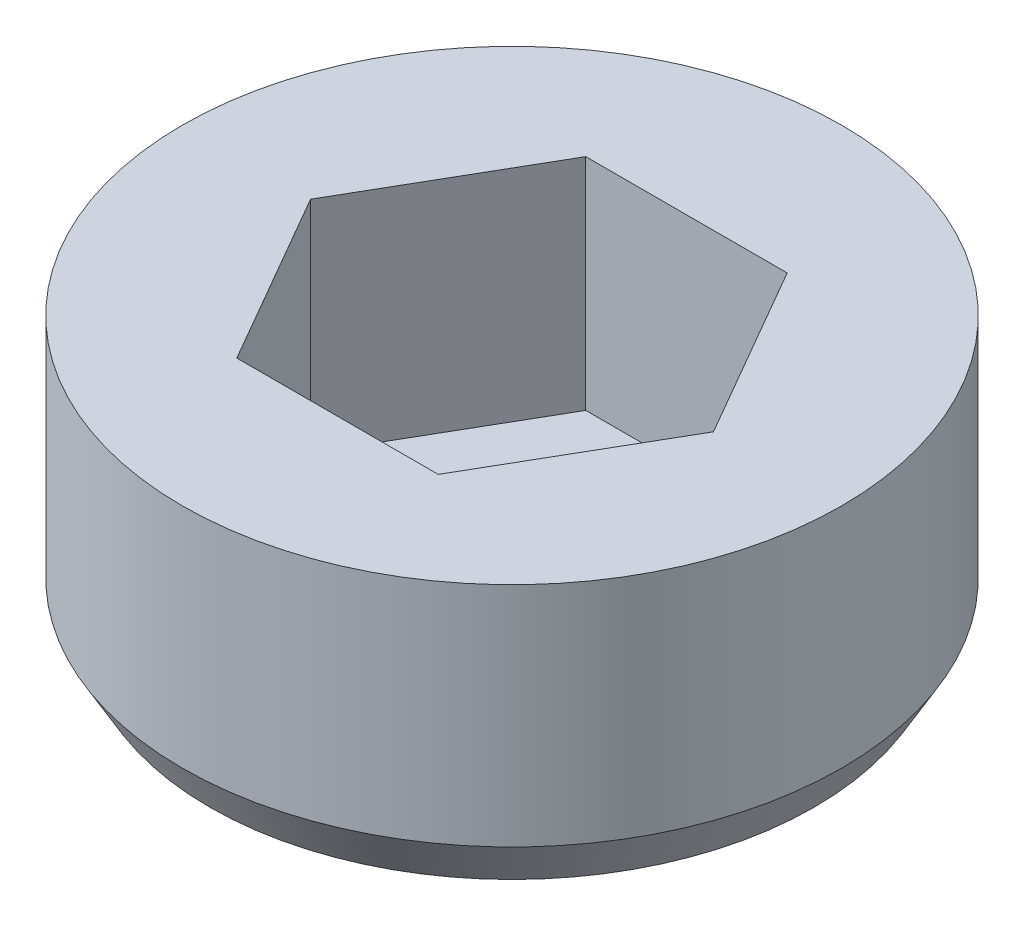
ISO-10303-21;
HEADER;
FILE_DESCRIPTION(('STEP AP214'),'2;1');
FILE_NAME('part.step','',(''),(''),'','','');
FILE_SCHEMA(('AUTOMOTIVE_DESIGN { 1 0 10303 214 1 1 1 1 }'));
ENDSEC;
DATA;
#1=APPLICATION_CONTEXT('core data for automotive mechanical design processes');
#2=APPLICATION_PROTOCOL_DEFINITION('international standard','automotive_design',2000,#1);
#3=PRODUCT_CONTEXT('',#1,'mechanical');
#4=PRODUCT('Part','Part','',(#3));
#5=PRODUCT_RELATED_PRODUCT_CATEGORY('part','',(#4));
#6=PRODUCT_DEFINITION_FORMATION('','',#4);
#7=PRODUCT_DEFINITION_CONTEXT('part definition',#1,'design');
#8=PRODUCT_DEFINITION('design','',#6,#7);
#9=PRODUCT_DEFINITION_SHAPE('','',#8);
#10=(LENGTH_UNIT() NAMED_UNIT(*) SI_UNIT(.MILLI.,.METRE.));
#11=(NAMED_UNIT(*) PLANE_ANGLE_UNIT() SI_UNIT($,.RADIAN.));
#12=(NAMED_UNIT(*) SI_UNIT($,.STERADIAN.) SOLID_ANGLE_UNIT());
#13=UNCERTAINTY_MEASURE_WITH_UNIT(LENGTH_MEASURE(1.E-05),#10,'distance_accuracy_value','');
#14=(GEOMETRIC_REPRESENTATION_CONTEXT(3) GLOBAL_UNCERTAINTY_ASSIGNED_CONTEXT((#13)) GLOBAL_UNIT_ASSIGNED_CONTEXT((#10,
#11,#12)) REPRESENTATION_CONTEXT('',''));
#15=CARTESIAN_POINT('',(0.,0.,0.));
#16=DIRECTION('',(0.,0.,1.));
#17=DIRECTION('',(1.,0.,0.));
#18=AXIS2_PLACEMENT_3D('',#15,#16,#17);
#19=CARTESIAN_POINT('',(0.,10.,0.));
#20=DIRECTION('',(0.,-1.,0.));
#21=DIRECTION('',(0.,0.,-1.));
#22=AXIS2_PLACEMENT_3D('',#19,#20,#21);
#23=CYLINDRICAL_SURFACE('',#22,3.1);
#24=CARTESIAN_POINT('',(0.,0.,0.));
#25=DIRECTION('',(0.,1.,0.));
#26=DIRECTION('',(0.,0.,1.));
#27=AXIS2_PLACEMENT_3D('',#24,#25,#26);
#28=CIRCLE('',#27,3.1);
#29=CARTESIAN_POINT('',(0.,0.,3.1));
#30=VERTEX_POINT('',#29);
#31=EDGE_CURVE('E150',#30,#30,#28,.T.);
#32=ORIENTED_EDGE('',*,*,#31,.F.);
#33=EDGE_LOOP('',(#32));
#34=FACE_BOUND('',#33,.T.);
#35=CARTESIAN_POINT('',(0.,2.,0.));
#36=DIRECTION('',(0.,1.,0.));
#37=DIRECTION('',(0.,0.,1.));
#38=AXIS2_PLACEMENT_3D('',#35,#36,#37);
#39=CIRCLE('',#38,3.1);
#40=CARTESIAN_POINT('',(0.,2.,3.1));
#41=VERTEX_POINT('',#40);
#42=EDGE_CURVE('E144',#41,#41,#39,.T.);
#43=ORIENTED_EDGE('',*,*,#42,.T.);
#44=EDGE_LOOP('',(#43));
#45=FACE_BOUND('',#44,.T.);
#46=ADVANCED_FACE('F41',(#34,#45),#23,.F.);
#47=CARTESIAN_POINT('',(0.,10.,0.));
#48=DIRECTION('',(0.,1.,0.));
#49=DIRECTION('',(0.,0.,1.));
#50=AXIS2_PLACEMENT_3D('',#47,#48,#49);
#51=PLANE('',#50);
#52=DIRECTION('',(0.5,0.,-0.866025403784439));
#53=VECTOR('',#52,1.);
#54=CARTESIAN_POINT('',(3.66617420935412,10.,6.35));
#55=LINE('',#54,#53);
#56=CARTESIAN_POINT('',(3.66617420935412,10.,6.35));
#57=VERTEX_POINT('',#56);
#58=CARTESIAN_POINT('',(7.33234841870825,10.,0.));
#59=VERTEX_POINT('',#58);
#60=EDGE_CURVE('E57',#57,#59,#55,.T.);
#61=ORIENTED_EDGE('',*,*,#60,.F.);
#62=DIRECTION('',(1.,0.,0.));
#63=VECTOR('',#62,1.);
#64=CARTESIAN_POINT('',(-3.66617420935412,10.,6.35));
#65=LINE('',#64,#63);
#66=CARTESIAN_POINT('',(-3.66617420935412,10.,6.35));
#67=VERTEX_POINT('',#66);
#68=EDGE_CURVE('E140',#67,#57,#65,.T.);
#69=ORIENTED_EDGE('',*,*,#68,.F.);
#70=DIRECTION('',(0.5,0.,0.866025403784439));
#71=VECTOR('',#70,1.);
#72=CARTESIAN_POINT('',(-7.33234841870825,10.,0.));
#73=LINE('',#72,#71);
#74=CARTESIAN_POINT('',(-7.33234841870825,10.,0.));
#75=VERTEX_POINT('',#74);
#76=EDGE_CURVE('E138',#75,#67,#73,.T.);
#77=ORIENTED_EDGE('',*,*,#76,.F.);
#78=DIRECTION('',(-0.5,0.,0.866025403784439));
#79=VECTOR('',#78,1.);
#80=CARTESIAN_POINT('',(-3.66617420935412,10.,-6.35));
#81=LINE('',#80,#79);
#82=CARTESIAN_POINT('',(-3.66617420935412,10.,-6.35));
#83=VERTEX_POINT('',#82);
#84=EDGE_CURVE('E105',#83,#75,#81,.T.);
#85=ORIENTED_EDGE('',*,*,#84,.F.);
#86=DIRECTION('',(-1.,0.,0.));
#87=VECTOR('',#86,1.);
#88=CARTESIAN_POINT('',(3.66617420935412,10.,-6.35));
#89=LINE('',#88,#87);
#90=CARTESIAN_POINT('',(3.66617420935412,10.,-6.35));
#91=VERTEX_POINT('',#90);
#92=EDGE_CURVE('E134',#91,#83,#89,.T.);
#93=ORIENTED_EDGE('',*,*,#92,.F.);
#94=DIRECTION('',(-0.5,0.,-0.866025403784438));
#95=VECTOR('',#94,1.);
#96=CARTESIAN_POINT('',(7.33234841870825,10.,0.));
#97=LINE('',#96,#95);
#98=EDGE_CURVE('E131',#59,#91,#97,.T.);
#99=ORIENTED_EDGE('',*,*,#98,.F.);
#100=EDGE_LOOP('',(#61,#69,#77,#85,#93,#99));
#101=FACE_BOUND('',#100,.T.);
#102=CARTESIAN_POINT('',(0.,10.,0.));
#103=DIRECTION('',(0.,1.,0.));
#104=DIRECTION('',(0.,0.,1.));
#105=AXIS2_PLACEMENT_3D('',#102,#103,#104);
#106=CIRCLE('',#105,12.);
#107=CARTESIAN_POINT('',(0.,10.,12.));
#108=VERTEX_POINT('',#107);
#109=EDGE_CURVE('E153',#108,#108,#106,.T.);
#110=ORIENTED_EDGE('',*,*,#109,.T.);
#111=EDGE_LOOP('',(#110));
#112=FACE_BOUND('',#111,.T.);
#113=ADVANCED_FACE('F174',(#101,#112),#51,.T.);
#114=CARTESIAN_POINT('',(0.,0.,0.));
#115=DIRECTION('',(0.,1.,0.));
#116=DIRECTION('',(0.,0.,1.));
#117=AXIS2_PLACEMENT_3D('',#114,#115,#116);
#118=PLANE('',#117);
#119=CARTESIAN_POINT('',(0.,0.,0.));
#120=DIRECTION('',(0.,1.,0.));
#121=DIRECTION('',(0.,0.,1.));
#122=AXIS2_PLACEMENT_3D('',#119,#120,#121);
#123=CIRCLE('',#122,11.);
#124=CARTESIAN_POINT('',(0.,0.,11.));
#125=VERTEX_POINT('',#124);
#126=EDGE_CURVE('E11',#125,#125,#123,.F.);
#127=ORIENTED_EDGE('',*,*,#126,.T.);
#128=EDGE_LOOP('',(#127));
#129=FACE_BOUND('',#128,.T.);
#130=ORIENTED_EDGE('',*,*,#31,.T.);
#131=EDGE_LOOP('',(#130));
#132=FACE_BOUND('',#131,.T.);
#133=ADVANCED_FACE('F180',(#129,#132),#118,.F.);
#134=CARTESIAN_POINT('',(0.,10.,0.));
#135=DIRECTION('',(0.,-1.,0.));
#136=DIRECTION('',(0.,0.,-1.));
#137=AXIS2_PLACEMENT_3D('',#134,#135,#136);
#138=CYLINDRICAL_SURFACE('',#137,12.);
#139=CARTESIAN_POINT('',(0.,1.73205080756888,0.));
#140=DIRECTION('',(0.,1.,0.));
#141=DIRECTION('',(0.,0.,1.));
#142=AXIS2_PLACEMENT_3D('',#139,#140,#141);
#143=CIRCLE('',#142,12.);
#144=CARTESIAN_POINT('',(0.,1.73205080756888,12.));
#145=VERTEX_POINT('',#144);
#146=EDGE_CURVE('E50',#145,#145,#143,.T.);
#147=ORIENTED_EDGE('',*,*,#146,.T.);
#148=EDGE_LOOP('',(#147));
#149=FACE_BOUND('',#148,.T.);
#150=ORIENTED_EDGE('',*,*,#109,.F.);
#151=EDGE_LOOP('',(#150));
#152=FACE_BOUND('',#151,.T.);
#153=ADVANCED_FACE('F160',(#149,#152),#138,.T.);
#154=CARTESIAN_POINT('',(3.66617420935412,2.,6.35));
#155=DIRECTION('',(0.866025403784439,0.,0.5));
#156=DIRECTION('',(0.5,0.,-0.866025403784439));
#157=AXIS2_PLACEMENT_3D('',#154,#155,#156);
#158=PLANE('',#157);
#159=ORIENTED_EDGE('',*,*,#60,.T.);
#160=DIRECTION('',(0.,1.,0.));
#161=VECTOR('',#160,1.);
#162=CARTESIAN_POINT('',(7.33234841870825,2.,0.));
#163=LINE('',#162,#161);
#164=CARTESIAN_POINT('',(7.33234841870825,2.,0.));
#165=VERTEX_POINT('',#164);
#166=EDGE_CURVE('E87',#165,#59,#163,.T.);
#167=ORIENTED_EDGE('',*,*,#166,.F.);
#168=DIRECTION('',(0.5,0.,-0.866025403784439));
#169=VECTOR('',#168,1.);
#170=CARTESIAN_POINT('',(3.66617420935412,2.,6.35));
#171=LINE('',#170,#169);
#172=CARTESIAN_POINT('',(3.66617420935412,2.,6.35));
#173=VERTEX_POINT('',#172);
#174=EDGE_CURVE('E142',#173,#165,#171,.T.);
#175=ORIENTED_EDGE('',*,*,#174,.F.);
#176=DIRECTION('',(0.,1.,0.));
#177=VECTOR('',#176,1.);
#178=CARTESIAN_POINT('',(3.66617420935412,2.,6.35));
#179=LINE('',#178,#177);
#180=EDGE_CURVE('E65',#173,#57,#179,.T.);
#181=ORIENTED_EDGE('',*,*,#180,.T.);
#182=EDGE_LOOP('',(#159,#167,#175,#181));
#183=FACE_BOUND('',#182,.T.);
#184=ADVANCED_FACE('F186',(#183),#158,.F.);
#185=CARTESIAN_POINT('',(-3.66617420935412,2.,6.35));
#186=DIRECTION('',(0.,0.,1.));
#187=DIRECTION('',(1.,0.,0.));
#188=AXIS2_PLACEMENT_3D('',#185,#186,#187);
#189=PLANE('',#188);
#190=ORIENTED_EDGE('',*,*,#68,.T.);
#191=ORIENTED_EDGE('',*,*,#180,.F.);
#192=DIRECTION('',(1.,0.,0.));
#193=VECTOR('',#192,1.);
#194=CARTESIAN_POINT('',(-3.66617420935412,2.,6.35));
#195=LINE('',#194,#193);
#196=CARTESIAN_POINT('',(-3.66617420935412,2.,6.35));
#197=VERTEX_POINT('',#196);
#198=EDGE_CURVE('E117',#197,#173,#195,.T.);
#199=ORIENTED_EDGE('',*,*,#198,.F.);
#200=DIRECTION('',(0.,1.,0.));
#201=VECTOR('',#200,1.);
#202=CARTESIAN_POINT('',(-3.66617420935412,2.,6.35));
#203=LINE('',#202,#201);
#204=EDGE_CURVE('E109',#197,#67,#203,.T.);
#205=ORIENTED_EDGE('',*,*,#204,.T.);
#206=EDGE_LOOP('',(#190,#191,#199,#205));
#207=FACE_BOUND('',#206,.T.);
#208=ADVANCED_FACE('F194',(#207),#189,.F.);
#209=CARTESIAN_POINT('',(-7.33234841870825,2.,0.));
#210=DIRECTION('',(-0.866025403784439,0.,0.5));
#211=DIRECTION('',(0.5,0.,0.866025403784439));
#212=AXIS2_PLACEMENT_3D('',#209,#210,#211);
#213=PLANE('',#212);
#214=ORIENTED_EDGE('',*,*,#76,.T.);
#215=ORIENTED_EDGE('',*,*,#204,.F.);
#216=DIRECTION('',(0.5,0.,0.866025403784439));
#217=VECTOR('',#216,1.);
#218=CARTESIAN_POINT('',(-7.33234841870825,2.,0.));
#219=LINE('',#218,#217);
#220=CARTESIAN_POINT('',(-7.33234841870825,2.,0.));
#221=VERTEX_POINT('',#220);
#222=EDGE_CURVE('E113',#221,#197,#219,.T.);
#223=ORIENTED_EDGE('',*,*,#222,.F.);
#224=DIRECTION('',(0.,1.,0.));
#225=VECTOR('',#224,1.);
#226=CARTESIAN_POINT('',(-7.33234841870825,2.,0.));
#227=LINE('',#226,#225);
#228=EDGE_CURVE('E98',#221,#75,#227,.T.);
#229=ORIENTED_EDGE('',*,*,#228,.T.);
#230=EDGE_LOOP('',(#214,#215,#223,#229));
#231=FACE_BOUND('',#230,.T.);
#232=ADVANCED_FACE('F114',(#231),#213,.F.);
#233=CARTESIAN_POINT('',(-3.66617420935412,2.,-6.35));
#234=DIRECTION('',(-0.866025403784439,0.,-0.5));
#235=DIRECTION('',(-0.5,0.,0.866025403784439));
#236=AXIS2_PLACEMENT_3D('',#233,#234,#235);
#237=PLANE('',#236);
#238=ORIENTED_EDGE('',*,*,#84,.T.);
#239=ORIENTED_EDGE('',*,*,#228,.F.);
#240=DIRECTION('',(-0.5,0.,0.866025403784439));
#241=VECTOR('',#240,1.);
#242=CARTESIAN_POINT('',(-3.66617420935412,2.,-6.35));
#243=LINE('',#242,#241);
#244=CARTESIAN_POINT('',(-3.66617420935412,2.,-6.35));
#245=VERTEX_POINT('',#244);
#246=EDGE_CURVE('E102',#245,#221,#243,.T.);
#247=ORIENTED_EDGE('',*,*,#246,.F.);
#248=DIRECTION('',(0.,1.,0.));
#249=VECTOR('',#248,1.);
#250=CARTESIAN_POINT('',(-3.66617420935412,2.,-6.35));
#251=LINE('',#250,#249);
#252=EDGE_CURVE('E110',#245,#83,#251,.T.);
#253=ORIENTED_EDGE('',*,*,#252,.T.);
#254=EDGE_LOOP('',(#238,#239,#247,#253));
#255=FACE_BOUND('',#254,.T.);
#256=ADVANCED_FACE('F100',(#255),#237,.F.);
#257=CARTESIAN_POINT('',(3.66617420935412,2.,-6.35));
#258=DIRECTION('',(0.,0.,-1.));
#259=DIRECTION('',(-1.,0.,0.));
#260=AXIS2_PLACEMENT_3D('',#257,#258,#259);
#261=PLANE('',#260);
#262=ORIENTED_EDGE('',*,*,#92,.T.);
#263=ORIENTED_EDGE('',*,*,#252,.F.);
#264=DIRECTION('',(-1.,0.,0.));
#265=VECTOR('',#264,1.);
#266=CARTESIAN_POINT('',(3.66617420935412,2.,-6.35));
#267=LINE('',#266,#265);
#268=CARTESIAN_POINT('',(3.66617420935412,2.,-6.35));
#269=VERTEX_POINT('',#268);
#270=EDGE_CURVE('E123',#269,#245,#267,.T.);
#271=ORIENTED_EDGE('',*,*,#270,.F.);
#272=DIRECTION('',(0.,1.,0.));
#273=VECTOR('',#272,1.);
#274=CARTESIAN_POINT('',(3.66617420935412,2.,-6.35));
#275=LINE('',#274,#273);
#276=EDGE_CURVE('E147',#269,#91,#275,.T.);
#277=ORIENTED_EDGE('',*,*,#276,.T.);
#278=EDGE_LOOP('',(#262,#263,#271,#277));
#279=FACE_BOUND('',#278,.T.);
#280=ADVANCED_FACE('F206',(#279),#261,.F.);
#281=CARTESIAN_POINT('',(7.33234841870825,2.,0.));
#282=DIRECTION('',(0.866025403784439,0.,-0.5));
#283=DIRECTION('',(-0.5,0.,-0.866025403784438));
#284=AXIS2_PLACEMENT_3D('',#281,#282,#283);
#285=PLANE('',#284);
#286=ORIENTED_EDGE('',*,*,#98,.T.);
#287=ORIENTED_EDGE('',*,*,#276,.F.);
#288=DIRECTION('',(-0.5,0.,-0.866025403784438));
#289=VECTOR('',#288,1.);
#290=CARTESIAN_POINT('',(7.33234841870825,2.,0.));
#291=LINE('',#290,#289);
#292=EDGE_CURVE('E125',#165,#269,#291,.T.);
#293=ORIENTED_EDGE('',*,*,#292,.F.);
#294=ORIENTED_EDGE('',*,*,#166,.T.);
#295=EDGE_LOOP('',(#286,#287,#293,#294));
#296=FACE_BOUND('',#295,.T.);
#297=ADVANCED_FACE('F169',(#296),#285,.F.);
#298=CARTESIAN_POINT('',(0.,2.,0.));
#299=DIRECTION('',(0.,1.,0.));
#300=DIRECTION('',(0.,0.,1.));
#301=AXIS2_PLACEMENT_3D('',#298,#299,#300);
#302=PLANE('',#301);
#303=ORIENTED_EDGE('',*,*,#42,.F.);
#304=EDGE_LOOP('',(#303));
#305=FACE_BOUND('',#304,.T.);
#306=ORIENTED_EDGE('',*,*,#174,.T.);
#307=ORIENTED_EDGE('',*,*,#292,.T.);
#308=ORIENTED_EDGE('',*,*,#270,.T.);
#309=ORIENTED_EDGE('',*,*,#246,.T.);
#310=ORIENTED_EDGE('',*,*,#222,.T.);
#311=ORIENTED_EDGE('',*,*,#198,.T.);
#312=EDGE_LOOP('',(#306,#307,#308,#309,#310,#311));
#313=FACE_BOUND('',#312,.T.);
#314=ADVANCED_FACE('F120',(#305,#313),#302,.T.);
#315=CARTESIAN_POINT('',(0.,1.73205080756888,0.));
#316=DIRECTION('',(0.,1.,0.));
#317=DIRECTION('',(0.,0.,1.));
#318=AXIS2_PLACEMENT_3D('',#315,#316,#317);
#319=CONICAL_SURFACE('',#318,12.,0.5235987755983);
#320=CARTESIAN_POINT('',(0.,0.,11.));
#321=CARTESIAN_POINT('',(0.,0.0180421959121757,11.0104166666667));
#322=CARTESIAN_POINT('',(0.,0.0360843918243516,11.0208333333333));
#323=CARTESIAN_POINT('',(0.,0.0721687836487033,11.0416666666667));
#324=CARTESIAN_POINT('',(0.,0.0902109795608791,11.0520833333333));
#325=CARTESIAN_POINT('',(0.,0.126295371385231,11.0729166666667));
#326=CARTESIAN_POINT('',(0.,0.144337567297407,11.0833333333333));
#327=CARTESIAN_POINT('',(0.,0.180421959121758,11.1041666666667));
#328=CARTESIAN_POINT('',(0.,0.198464155033934,11.1145833333333));
#329=CARTESIAN_POINT('',(0.,0.234548546858286,11.1354166666667));
#330=CARTESIAN_POINT('',(0.,0.252590742770462,11.1458333333333));
#331=CARTESIAN_POINT('',(0.,0.288675134594814,11.1666666666667));
#332=CARTESIAN_POINT('',(0.,0.30671733050699,11.1770833333333));
#333=CARTESIAN_POINT('',(0.,0.342801722331341,11.1979166666667));
#334=CARTESIAN_POINT('',(0.,0.360843918243517,11.2083333333333));
#335=CARTESIAN_POINT('',(0.,0.396928310067869,11.2291666666667));
#336=CARTESIAN_POINT('',(0.,0.414970505980045,11.2395833333333));
#337=CARTESIAN_POINT('',(0.,0.451054897804396,11.2604166666667));
#338=CARTESIAN_POINT('',(0.,0.469097093716572,11.2708333333333));
#339=CARTESIAN_POINT('',(0.,0.505181485540924,11.2916666666667));
#340=CARTESIAN_POINT('',(0.,0.5232236814531,11.3020833333333));
#341=CARTESIAN_POINT('',(0.,0.559308073277451,11.3229166666667));
#342=CARTESIAN_POINT('',(0.,0.577350269189627,11.3333333333333));
#343=CARTESIAN_POINT('',(0.,0.613434661013979,11.3541666666667));
#344=CARTESIAN_POINT('',(0.,0.631476856926155,11.3645833333333));
#345=CARTESIAN_POINT('',(0.,0.667561248750507,11.3854166666667));
#346=CARTESIAN_POINT('',(0.,0.685603444662682,11.3958333333333));
#347=CARTESIAN_POINT('',(0.,0.721687836487034,11.4166666666667));
#348=CARTESIAN_POINT('',(0.,0.73973003239921,11.4270833333333));
#349=CARTESIAN_POINT('',(0.,0.775814424223562,11.4479166666667));
#350=CARTESIAN_POINT('',(0.,0.793856620135738,11.4583333333333));
#351=CARTESIAN_POINT('',(0.,0.829941011960089,11.4791666666667));
#352=CARTESIAN_POINT('',(0.,0.847983207872265,11.4895833333333));
#353=CARTESIAN_POINT('',(0.,0.884067599696617,11.5104166666667));
#354=CARTESIAN_POINT('',(0.,0.902109795608793,11.5208333333333));
#355=CARTESIAN_POINT('',(0.,0.938194187433144,11.5416666666667));
#356=CARTESIAN_POINT('',(0.,0.95623638334532,11.5520833333333));
#357=CARTESIAN_POINT('',(0.,0.992320775169672,11.5729166666667));
#358=CARTESIAN_POINT('',(0.,1.01036297108185,11.5833333333333));
#359=CARTESIAN_POINT('',(0.,1.0464473629062,11.6041666666667));
#360=CARTESIAN_POINT('',(0.,1.06448955881838,11.6145833333333));
#361=CARTESIAN_POINT('',(0.,1.10057395064273,11.6354166666667));
#362=CARTESIAN_POINT('',(0.,1.1186161465549,11.6458333333333));
#363=CARTESIAN_POINT('',(0.,1.15470053837925,11.6666666666667));
#364=CARTESIAN_POINT('',(0.,1.17274273429143,11.6770833333333));
#365=CARTESIAN_POINT('',(0.,1.20882712611578,11.6979166666667));
#366=CARTESIAN_POINT('',(0.,1.22686932202796,11.7083333333333));
#367=CARTESIAN_POINT('',(0.,1.26295371385231,11.7291666666667));
#368=CARTESIAN_POINT('',(0.,1.28099590976449,11.7395833333333));
#369=CARTESIAN_POINT('',(0.,1.31708030158884,11.7604166666667));
#370=CARTESIAN_POINT('',(0.,1.33512249750101,11.7708333333333));
#371=CARTESIAN_POINT('',(0.,1.37120688932536,11.7916666666667));
#372=CARTESIAN_POINT('',(0.,1.38924908523754,11.8020833333333));
#373=CARTESIAN_POINT('',(0.,1.42533347706189,11.8229166666667));
#374=CARTESIAN_POINT('',(0.,1.44337567297407,11.8333333333333));
#375=CARTESIAN_POINT('',(0.,1.47946006479842,11.8541666666667));
#376=CARTESIAN_POINT('',(0.,1.4975022607106,11.8645833333333));
#377=CARTESIAN_POINT('',(0.,1.53358665253495,11.8854166666667));
#378=CARTESIAN_POINT('',(0.,1.55162884844712,11.8958333333333));
#379=CARTESIAN_POINT('',(0.,1.58771324027148,11.9166666666667));
#380=CARTESIAN_POINT('',(0.,1.60575543618365,11.9270833333333));
#381=CARTESIAN_POINT('',(0.,1.641839828008,11.9479166666667));
#382=CARTESIAN_POINT('',(0.,1.65988202392018,11.9583333333333));
#383=CARTESIAN_POINT('',(0.,1.69596641574453,11.9791666666667));
#384=CARTESIAN_POINT('',(0.,1.71400861165671,11.9895833333333));
#385=CARTESIAN_POINT('',(0.,1.73205080756888,12.));
#386=B_SPLINE_CURVE_WITH_KNOTS('',3,(#320,#321,#322,#323,#324,#325,#326,#327,#328,#329,#330,
#331,#332,#333,#334,#335,#336,#337,#338,#339,#340,#341,#342,#343,#344,#345,#346,#347,#348,#349,
#350,#351,#352,#353,#354,#355,#356,#357,#358,#359,#360,#361,#362,#363,#364,#365,#366,#367,#368,
#369,#370,#371,#372,#373,#374,#375,#376,#377,#378,#379,#380,#381,#382,#383,#384,#385),
.UNSPECIFIED.,.F.,.F.,(4,2,2,2,2,2,2,2,2,2,2,2,2,2,2,2,2,2,2,2,2,2,2,2,2,2,2,2,2,2,2,2,4),(0.,
0.0625000000000002,0.125,0.187500000000001,0.250000000000001,0.312500000000001,
0.375000000000001,0.437500000000001,0.500000000000001,0.562500000000002,0.625000000000003,
0.687500000000003,0.750000000000003,0.812500000000003,0.875000000000003,0.937500000000003,1.,
1.0625,1.125,1.1875,1.25,1.3125,1.375,1.4375,1.5,1.56250000000001,1.62500000000001,
1.68750000000001,1.75000000000001,1.81250000000001,1.87500000000001,1.93750000000001,
2.00000000000001),.UNSPECIFIED.);
#387=EDGE_CURVE('BSEAM44',#125,#145,#386,.T.);
#388=ORIENTED_EDGE('',*,*,#126,.F.);
#389=ORIENTED_EDGE('',*,*,#146,.F.);
#390=ORIENTED_EDGE('',*,*,#387,.T.);
#391=ORIENTED_EDGE('',*,*,#387,.F.);
#392=EDGE_LOOP('',(#388,#390,#389,#391));
#393=FACE_BOUND('',#392,.T.);
#394=ADVANCED_FACE('F44',(#393),#319,.T.);
#395=CLOSED_SHELL('',(#46,#113,#133,#153,#184,#208,#232,#256,#280,#297,#314,#394));
#396=MANIFOLD_SOLID_BREP('B2',#395);
#397=ADVANCED_BREP_SHAPE_REPRESENTATION('',(#18,#396),#14);
#398=SHAPE_DEFINITION_REPRESENTATION(#9,#397);
ENDSEC;
END-ISO-10303-21;
